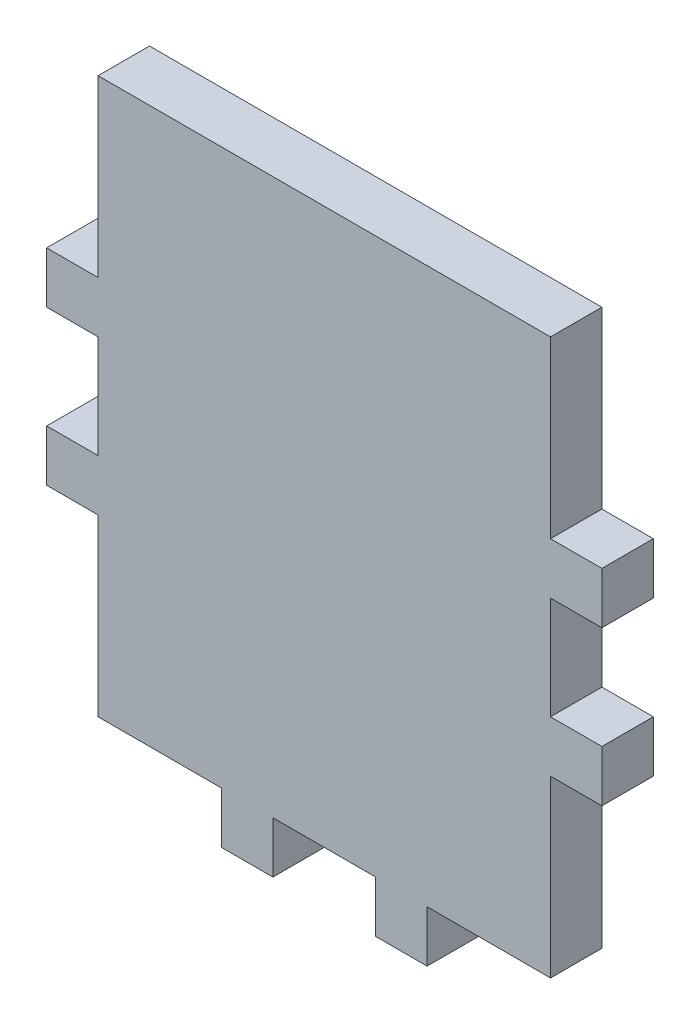
ISO-10303-21;
HEADER;
FILE_DESCRIPTION(('STEP AP214'),'2;1');
FILE_NAME('part.step','',(''),(''),'','','');
FILE_SCHEMA(('AUTOMOTIVE_DESIGN { 1 0 10303 214 1 1 1 1 }'));
ENDSEC;
DATA;
#1=APPLICATION_CONTEXT('core data for automotive mechanical design processes');
#2=APPLICATION_PROTOCOL_DEFINITION('international standard','automotive_design',2000,#1);
#3=PRODUCT_CONTEXT('',#1,'mechanical');
#4=PRODUCT('Part','Part','',(#3));
#5=PRODUCT_RELATED_PRODUCT_CATEGORY('part','',(#4));
#6=PRODUCT_DEFINITION_FORMATION('','',#4);
#7=PRODUCT_DEFINITION_CONTEXT('part definition',#1,'design');
#8=PRODUCT_DEFINITION('design','',#6,#7);
#9=PRODUCT_DEFINITION_SHAPE('','',#8);
#10=(LENGTH_UNIT() NAMED_UNIT(*) SI_UNIT(.MILLI.,.METRE.));
#11=(NAMED_UNIT(*) PLANE_ANGLE_UNIT() SI_UNIT($,.RADIAN.));
#12=(NAMED_UNIT(*) SI_UNIT($,.STERADIAN.) SOLID_ANGLE_UNIT());
#13=UNCERTAINTY_MEASURE_WITH_UNIT(LENGTH_MEASURE(1.E-05),#10,'distance_accuracy_value','');
#14=(GEOMETRIC_REPRESENTATION_CONTEXT(3) GLOBAL_UNCERTAINTY_ASSIGNED_CONTEXT((#13)) GLOBAL_UNIT_ASSIGNED_CONTEXT((#10,
#11,#12)) REPRESENTATION_CONTEXT('',''));
#15=CARTESIAN_POINT('',(0.,0.,0.));
#16=DIRECTION('',(0.,0.,1.));
#17=DIRECTION('',(1.,0.,0.));
#18=AXIS2_PLACEMENT_3D('',#15,#16,#17);
#19=CARTESIAN_POINT('',(0.,17.,5.));
#20=DIRECTION('',(0.,1.,0.));
#21=DIRECTION('',(0.,0.,1.));
#22=AXIS2_PLACEMENT_3D('',#19,#20,#21);
#23=PLANE('',#22);
#24=DIRECTION('',(1.,0.,0.));
#25=VECTOR('',#24,1.);
#26=CARTESIAN_POINT('',(0.,17.,0.));
#27=LINE('',#26,#25);
#28=CARTESIAN_POINT('',(-27.,17.,0.));
#29=VERTEX_POINT('',#28);
#30=CARTESIAN_POINT('',(-22.,17.,0.));
#31=VERTEX_POINT('',#30);
#32=EDGE_CURVE('E254',#29,#31,#27,.T.);
#33=ORIENTED_EDGE('',*,*,#32,.T.);
#34=DIRECTION('',(0.,0.,-1.));
#35=VECTOR('',#34,1.);
#36=CARTESIAN_POINT('',(-22.,17.,5.));
#37=LINE('',#36,#35);
#38=CARTESIAN_POINT('',(-22.,17.,5.));
#39=VERTEX_POINT('',#38);
#40=EDGE_CURVE('E11',#39,#31,#37,.T.);
#41=ORIENTED_EDGE('',*,*,#40,.F.);
#42=DIRECTION('',(1.,0.,0.));
#43=VECTOR('',#42,1.);
#44=CARTESIAN_POINT('',(0.,17.,5.));
#45=LINE('',#44,#43);
#46=CARTESIAN_POINT('',(-27.,17.,5.));
#47=VERTEX_POINT('',#46);
#48=EDGE_CURVE('E325',#47,#39,#45,.T.);
#49=ORIENTED_EDGE('',*,*,#48,.F.);
#50=DIRECTION('',(0.,0.,-1.));
#51=VECTOR('',#50,1.);
#52=CARTESIAN_POINT('',(-27.,17.,5.));
#53=LINE('',#52,#51);
#54=EDGE_CURVE('E250',#47,#29,#53,.T.);
#55=ORIENTED_EDGE('',*,*,#54,.T.);
#56=EDGE_LOOP('',(#33,#41,#49,#55));
#57=FACE_BOUND('',#56,.T.);
#58=ADVANCED_FACE('F39',(#57),#23,.F.);
#59=CARTESIAN_POINT('',(-22.,0.,5.));
#60=DIRECTION('',(1.,0.,0.));
#61=DIRECTION('',(0.,0.,-1.));
#62=AXIS2_PLACEMENT_3D('',#59,#60,#61);
#63=PLANE('',#62);
#64=DIRECTION('',(0.,-1.,0.));
#65=VECTOR('',#64,1.);
#66=CARTESIAN_POINT('',(-22.,0.,0.));
#67=LINE('',#66,#65);
#68=CARTESIAN_POINT('',(-22.,0.,0.));
#69=VERTEX_POINT('',#68);
#70=EDGE_CURVE('E257',#31,#69,#67,.T.);
#71=ORIENTED_EDGE('',*,*,#70,.T.);
#72=DIRECTION('',(0.,0.,-1.));
#73=VECTOR('',#72,1.);
#74=CARTESIAN_POINT('',(-22.,0.,5.));
#75=LINE('',#74,#73);
#76=CARTESIAN_POINT('',(-22.,0.,5.));
#77=VERTEX_POINT('',#76);
#78=EDGE_CURVE('E47',#77,#69,#75,.T.);
#79=ORIENTED_EDGE('',*,*,#78,.F.);
#80=DIRECTION('',(0.,-1.,0.));
#81=VECTOR('',#80,1.);
#82=CARTESIAN_POINT('',(-22.,0.,5.));
#83=LINE('',#82,#81);
#84=EDGE_CURVE('E154',#39,#77,#83,.T.);
#85=ORIENTED_EDGE('',*,*,#84,.F.);
#86=ORIENTED_EDGE('',*,*,#40,.T.);
#87=EDGE_LOOP('',(#71,#79,#85,#86));
#88=FACE_BOUND('',#87,.T.);
#89=ADVANCED_FACE('F468',(#88),#63,.F.);
#90=CARTESIAN_POINT('',(0.,0.,5.));
#91=DIRECTION('',(0.,1.,0.));
#92=DIRECTION('',(-1.,0.,0.));
#93=AXIS2_PLACEMENT_3D('',#90,#91,#92);
#94=PLANE('',#93);
#95=DIRECTION('',(1.,0.,0.));
#96=VECTOR('',#95,1.);
#97=CARTESIAN_POINT('',(0.,0.,0.));
#98=LINE('',#97,#96);
#99=CARTESIAN_POINT('',(-9.99999999999999,0.,0.));
#100=VERTEX_POINT('',#99);
#101=EDGE_CURVE('E259',#69,#100,#98,.T.);
#102=ORIENTED_EDGE('',*,*,#101,.T.);
#103=DIRECTION('',(0.,0.,-1.));
#104=VECTOR('',#103,1.);
#105=CARTESIAN_POINT('',(-9.99999999999999,0.,5.));
#106=LINE('',#105,#104);
#107=CARTESIAN_POINT('',(-9.99999999999999,0.,5.));
#108=VERTEX_POINT('',#107);
#109=EDGE_CURVE('E378',#108,#100,#106,.T.);
#110=ORIENTED_EDGE('',*,*,#109,.F.);
#111=DIRECTION('',(1.,0.,0.));
#112=VECTOR('',#111,1.);
#113=CARTESIAN_POINT('',(0.,0.,5.));
#114=LINE('',#113,#112);
#115=EDGE_CURVE('E385',#77,#108,#114,.T.);
#116=ORIENTED_EDGE('',*,*,#115,.F.);
#117=ORIENTED_EDGE('',*,*,#78,.T.);
#118=EDGE_LOOP('',(#102,#110,#116,#117));
#119=FACE_BOUND('',#118,.T.);
#120=ADVANCED_FACE('F383',(#119),#94,.F.);
#121=CARTESIAN_POINT('',(-9.99999999999999,0.,5.));
#122=DIRECTION('',(-1.,0.,0.));
#123=DIRECTION('',(0.,0.,1.));
#124=AXIS2_PLACEMENT_3D('',#121,#122,#123);
#125=PLANE('',#124);
#126=DIRECTION('',(0.,1.,0.));
#127=VECTOR('',#126,1.);
#128=CARTESIAN_POINT('',(-9.99999999999999,0.,0.));
#129=LINE('',#128,#127);
#130=CARTESIAN_POINT('',(-9.99999999999999,-5.,0.));
#131=VERTEX_POINT('',#130);
#132=EDGE_CURVE('E262',#131,#100,#129,.T.);
#133=ORIENTED_EDGE('',*,*,#132,.F.);
#134=DIRECTION('',(0.,0.,-1.));
#135=VECTOR('',#134,1.);
#136=CARTESIAN_POINT('',(-9.99999999999999,-5.,5.));
#137=LINE('',#136,#135);
#138=CARTESIAN_POINT('',(-9.99999999999999,-5.,5.));
#139=VERTEX_POINT('',#138);
#140=EDGE_CURVE('E376',#139,#131,#137,.T.);
#141=ORIENTED_EDGE('',*,*,#140,.F.);
#142=DIRECTION('',(0.,1.,0.));
#143=VECTOR('',#142,1.);
#144=CARTESIAN_POINT('',(-9.99999999999999,0.,5.));
#145=LINE('',#144,#143);
#146=EDGE_CURVE('E396',#139,#108,#145,.T.);
#147=ORIENTED_EDGE('',*,*,#146,.T.);
#148=ORIENTED_EDGE('',*,*,#109,.T.);
#149=EDGE_LOOP('',(#133,#141,#147,#148));
#150=FACE_BOUND('',#149,.T.);
#151=ADVANCED_FACE('F393',(#150),#125,.T.);
#152=CARTESIAN_POINT('',(0.,-5.,5.));
#153=DIRECTION('',(0.,-1.,0.));
#154=DIRECTION('',(1.,0.,0.));
#155=AXIS2_PLACEMENT_3D('',#152,#153,#154);
#156=PLANE('',#155);
#157=DIRECTION('',(-1.,0.,0.));
#158=VECTOR('',#157,1.);
#159=CARTESIAN_POINT('',(0.,-5.,0.));
#160=LINE('',#159,#158);
#161=CARTESIAN_POINT('',(-4.99999999999999,-5.,0.));
#162=VERTEX_POINT('',#161);
#163=EDGE_CURVE('E265',#162,#131,#160,.T.);
#164=ORIENTED_EDGE('',*,*,#163,.F.);
#165=DIRECTION('',(0.,0.,-1.));
#166=VECTOR('',#165,1.);
#167=CARTESIAN_POINT('',(-4.99999999999999,-5.,5.));
#168=LINE('',#167,#166);
#169=CARTESIAN_POINT('',(-4.99999999999999,-5.,5.));
#170=VERTEX_POINT('',#169);
#171=EDGE_CURVE('E374',#170,#162,#168,.T.);
#172=ORIENTED_EDGE('',*,*,#171,.F.);
#173=DIRECTION('',(-1.,0.,0.));
#174=VECTOR('',#173,1.);
#175=CARTESIAN_POINT('',(0.,-5.,5.));
#176=LINE('',#175,#174);
#177=EDGE_CURVE('E399',#170,#139,#176,.T.);
#178=ORIENTED_EDGE('',*,*,#177,.T.);
#179=ORIENTED_EDGE('',*,*,#140,.T.);
#180=EDGE_LOOP('',(#164,#172,#178,#179));
#181=FACE_BOUND('',#180,.T.);
#182=ADVANCED_FACE('F479',(#181),#156,.T.);
#183=CARTESIAN_POINT('',(-4.99999999999999,0.,5.));
#184=DIRECTION('',(-1.,0.,0.));
#185=DIRECTION('',(0.,0.,1.));
#186=AXIS2_PLACEMENT_3D('',#183,#184,#185);
#187=PLANE('',#186);
#188=DIRECTION('',(0.,1.,0.));
#189=VECTOR('',#188,1.);
#190=CARTESIAN_POINT('',(-4.99999999999999,0.,0.));
#191=LINE('',#190,#189);
#192=CARTESIAN_POINT('',(-4.99999999999999,0.,0.));
#193=VERTEX_POINT('',#192);
#194=EDGE_CURVE('E268',#162,#193,#191,.T.);
#195=ORIENTED_EDGE('',*,*,#194,.T.);
#196=DIRECTION('',(0.,0.,-1.));
#197=VECTOR('',#196,1.);
#198=CARTESIAN_POINT('',(-4.99999999999999,0.,5.));
#199=LINE('',#198,#197);
#200=CARTESIAN_POINT('',(-4.99999999999999,0.,5.));
#201=VERTEX_POINT('',#200);
#202=EDGE_CURVE('E372',#201,#193,#199,.T.);
#203=ORIENTED_EDGE('',*,*,#202,.F.);
#204=DIRECTION('',(0.,1.,0.));
#205=VECTOR('',#204,1.);
#206=CARTESIAN_POINT('',(-4.99999999999999,0.,5.));
#207=LINE('',#206,#205);
#208=EDGE_CURVE('E401',#170,#201,#207,.T.);
#209=ORIENTED_EDGE('',*,*,#208,.F.);
#210=ORIENTED_EDGE('',*,*,#171,.T.);
#211=EDGE_LOOP('',(#195,#203,#209,#210));
#212=FACE_BOUND('',#211,.T.);
#213=ADVANCED_FACE('F482',(#212),#187,.F.);
#214=CARTESIAN_POINT('',(0.,0.,5.));
#215=DIRECTION('',(0.,-1.,0.));
#216=DIRECTION('',(1.,0.,0.));
#217=AXIS2_PLACEMENT_3D('',#214,#215,#216);
#218=PLANE('',#217);
#219=DIRECTION('',(-1.,0.,0.));
#220=VECTOR('',#219,1.);
#221=CARTESIAN_POINT('',(0.,0.,0.));
#222=LINE('',#221,#220);
#223=CARTESIAN_POINT('',(5.00000000000001,0.,0.));
#224=VERTEX_POINT('',#223);
#225=EDGE_CURVE('E271',#224,#193,#222,.T.);
#226=ORIENTED_EDGE('',*,*,#225,.F.);
#227=DIRECTION('',(0.,0.,-1.));
#228=VECTOR('',#227,1.);
#229=CARTESIAN_POINT('',(5.00000000000001,0.,5.));
#230=LINE('',#229,#228);
#231=CARTESIAN_POINT('',(5.00000000000001,0.,5.));
#232=VERTEX_POINT('',#231);
#233=EDGE_CURVE('E370',#232,#224,#230,.T.);
#234=ORIENTED_EDGE('',*,*,#233,.F.);
#235=DIRECTION('',(-1.,0.,0.));
#236=VECTOR('',#235,1.);
#237=CARTESIAN_POINT('',(0.,0.,5.));
#238=LINE('',#237,#236);
#239=EDGE_CURVE('E407',#232,#201,#238,.T.);
#240=ORIENTED_EDGE('',*,*,#239,.T.);
#241=ORIENTED_EDGE('',*,*,#202,.T.);
#242=EDGE_LOOP('',(#226,#234,#240,#241));
#243=FACE_BOUND('',#242,.T.);
#244=ADVANCED_FACE('F486',(#243),#218,.T.);
#245=CARTESIAN_POINT('',(5.00000000000001,0.,5.));
#246=DIRECTION('',(1.,0.,0.));
#247=DIRECTION('',(0.,0.,-1.));
#248=AXIS2_PLACEMENT_3D('',#245,#246,#247);
#249=PLANE('',#248);
#250=DIRECTION('',(0.,-1.,0.));
#251=VECTOR('',#250,1.);
#252=CARTESIAN_POINT('',(5.00000000000001,0.,0.));
#253=LINE('',#252,#251);
#254=CARTESIAN_POINT('',(5.00000000000001,-5.,0.));
#255=VERTEX_POINT('',#254);
#256=EDGE_CURVE('E274',#224,#255,#253,.T.);
#257=ORIENTED_EDGE('',*,*,#256,.T.);
#258=DIRECTION('',(0.,0.,-1.));
#259=VECTOR('',#258,1.);
#260=CARTESIAN_POINT('',(5.00000000000001,-5.,5.));
#261=LINE('',#260,#259);
#262=CARTESIAN_POINT('',(5.00000000000001,-5.,5.));
#263=VERTEX_POINT('',#262);
#264=EDGE_CURVE('E367',#263,#255,#261,.T.);
#265=ORIENTED_EDGE('',*,*,#264,.F.);
#266=DIRECTION('',(0.,-1.,0.));
#267=VECTOR('',#266,1.);
#268=CARTESIAN_POINT('',(5.00000000000001,0.,5.));
#269=LINE('',#268,#267);
#270=EDGE_CURVE('E410',#232,#263,#269,.T.);
#271=ORIENTED_EDGE('',*,*,#270,.F.);
#272=ORIENTED_EDGE('',*,*,#233,.T.);
#273=EDGE_LOOP('',(#257,#265,#271,#272));
#274=FACE_BOUND('',#273,.T.);
#275=ADVANCED_FACE('F490',(#274),#249,.F.);
#276=CARTESIAN_POINT('',(0.,-5.,5.));
#277=DIRECTION('',(0.,1.,0.));
#278=DIRECTION('',(-1.,0.,0.));
#279=AXIS2_PLACEMENT_3D('',#276,#277,#278);
#280=PLANE('',#279);
#281=DIRECTION('',(1.,0.,0.));
#282=VECTOR('',#281,1.);
#283=CARTESIAN_POINT('',(0.,-5.,0.));
#284=LINE('',#283,#282);
#285=CARTESIAN_POINT('',(10.,-5.,0.));
#286=VERTEX_POINT('',#285);
#287=EDGE_CURVE('E276',#255,#286,#284,.T.);
#288=ORIENTED_EDGE('',*,*,#287,.T.);
#289=DIRECTION('',(0.,0.,-1.));
#290=VECTOR('',#289,1.);
#291=CARTESIAN_POINT('',(10.,-5.,5.));
#292=LINE('',#291,#290);
#293=CARTESIAN_POINT('',(10.,-5.,5.));
#294=VERTEX_POINT('',#293);
#295=EDGE_CURVE('E364',#294,#286,#292,.T.);
#296=ORIENTED_EDGE('',*,*,#295,.F.);
#297=DIRECTION('',(1.,0.,0.));
#298=VECTOR('',#297,1.);
#299=CARTESIAN_POINT('',(0.,-5.,5.));
#300=LINE('',#299,#298);
#301=EDGE_CURVE('E412',#263,#294,#300,.T.);
#302=ORIENTED_EDGE('',*,*,#301,.F.);
#303=ORIENTED_EDGE('',*,*,#264,.T.);
#304=EDGE_LOOP('',(#288,#296,#302,#303));
#305=FACE_BOUND('',#304,.T.);
#306=ADVANCED_FACE('F494',(#305),#280,.F.);
#307=CARTESIAN_POINT('',(10.,0.,5.));
#308=DIRECTION('',(-1.,0.,0.));
#309=DIRECTION('',(0.,0.,1.));
#310=AXIS2_PLACEMENT_3D('',#307,#308,#309);
#311=PLANE('',#310);
#312=DIRECTION('',(0.,1.,0.));
#313=VECTOR('',#312,1.);
#314=CARTESIAN_POINT('',(10.,0.,0.));
#315=LINE('',#314,#313);
#316=CARTESIAN_POINT('',(10.,0.,0.));
#317=VERTEX_POINT('',#316);
#318=EDGE_CURVE('E278',#286,#317,#315,.T.);
#319=ORIENTED_EDGE('',*,*,#318,.T.);
#320=DIRECTION('',(0.,0.,-1.));
#321=VECTOR('',#320,1.);
#322=CARTESIAN_POINT('',(10.,0.,5.));
#323=LINE('',#322,#321);
#324=CARTESIAN_POINT('',(10.,0.,5.));
#325=VERTEX_POINT('',#324);
#326=EDGE_CURVE('E361',#325,#317,#323,.T.);
#327=ORIENTED_EDGE('',*,*,#326,.F.);
#328=DIRECTION('',(0.,1.,0.));
#329=VECTOR('',#328,1.);
#330=CARTESIAN_POINT('',(10.,0.,5.));
#331=LINE('',#330,#329);
#332=EDGE_CURVE('E414',#294,#325,#331,.T.);
#333=ORIENTED_EDGE('',*,*,#332,.F.);
#334=ORIENTED_EDGE('',*,*,#295,.T.);
#335=EDGE_LOOP('',(#319,#327,#333,#334));
#336=FACE_BOUND('',#335,.T.);
#337=ADVANCED_FACE('F498',(#336),#311,.F.);
#338=CARTESIAN_POINT('',(0.,0.,5.));
#339=DIRECTION('',(0.,1.,0.));
#340=DIRECTION('',(-1.,0.,0.));
#341=AXIS2_PLACEMENT_3D('',#338,#339,#340);
#342=PLANE('',#341);
#343=DIRECTION('',(1.,0.,0.));
#344=VECTOR('',#343,1.);
#345=CARTESIAN_POINT('',(0.,0.,0.));
#346=LINE('',#345,#344);
#347=CARTESIAN_POINT('',(22.,0.,0.));
#348=VERTEX_POINT('',#347);
#349=EDGE_CURVE('E280',#317,#348,#346,.T.);
#350=ORIENTED_EDGE('',*,*,#349,.T.);
#351=DIRECTION('',(0.,0.,-1.));
#352=VECTOR('',#351,1.);
#353=CARTESIAN_POINT('',(22.,0.,5.));
#354=LINE('',#353,#352);
#355=CARTESIAN_POINT('',(22.,0.,5.));
#356=VERTEX_POINT('',#355);
#357=EDGE_CURVE('E358',#356,#348,#354,.T.);
#358=ORIENTED_EDGE('',*,*,#357,.F.);
#359=DIRECTION('',(1.,0.,0.));
#360=VECTOR('',#359,1.);
#361=CARTESIAN_POINT('',(0.,0.,5.));
#362=LINE('',#361,#360);
#363=EDGE_CURVE('E416',#325,#356,#362,.T.);
#364=ORIENTED_EDGE('',*,*,#363,.F.);
#365=ORIENTED_EDGE('',*,*,#326,.T.);
#366=EDGE_LOOP('',(#350,#358,#364,#365));
#367=FACE_BOUND('',#366,.T.);
#368=ADVANCED_FACE('F502',(#367),#342,.F.);
#369=CARTESIAN_POINT('',(22.,0.,5.));
#370=DIRECTION('',(-1.,0.,0.));
#371=DIRECTION('',(0.,-1.,0.));
#372=AXIS2_PLACEMENT_3D('',#369,#370,#371);
#373=PLANE('',#372);
#374=DIRECTION('',(0.,1.,0.));
#375=VECTOR('',#374,1.);
#376=CARTESIAN_POINT('',(22.,0.,0.));
#377=LINE('',#376,#375);
#378=CARTESIAN_POINT('',(22.,17.,0.));
#379=VERTEX_POINT('',#378);
#380=EDGE_CURVE('E282',#348,#379,#377,.T.);
#381=ORIENTED_EDGE('',*,*,#380,.T.);
#382=DIRECTION('',(0.,0.,-1.));
#383=VECTOR('',#382,1.);
#384=CARTESIAN_POINT('',(22.,17.,5.));
#385=LINE('',#384,#383);
#386=CARTESIAN_POINT('',(22.,17.,5.));
#387=VERTEX_POINT('',#386);
#388=EDGE_CURVE('E356',#387,#379,#385,.T.);
#389=ORIENTED_EDGE('',*,*,#388,.F.);
#390=DIRECTION('',(0.,1.,0.));
#391=VECTOR('',#390,1.);
#392=CARTESIAN_POINT('',(22.,0.,5.));
#393=LINE('',#392,#391);
#394=EDGE_CURVE('E418',#356,#387,#393,.T.);
#395=ORIENTED_EDGE('',*,*,#394,.F.);
#396=ORIENTED_EDGE('',*,*,#357,.T.);
#397=EDGE_LOOP('',(#381,#389,#395,#396));
#398=FACE_BOUND('',#397,.T.);
#399=ADVANCED_FACE('F506',(#398),#373,.F.);
#400=CARTESIAN_POINT('',(0.,17.,5.));
#401=DIRECTION('',(0.,-1.,0.));
#402=DIRECTION('',(0.,0.,-1.));
#403=AXIS2_PLACEMENT_3D('',#400,#401,#402);
#404=PLANE('',#403);
#405=DIRECTION('',(-1.,0.,0.));
#406=VECTOR('',#405,1.);
#407=CARTESIAN_POINT('',(0.,17.,0.));
#408=LINE('',#407,#406);
#409=CARTESIAN_POINT('',(27.,17.,0.));
#410=VERTEX_POINT('',#409);
#411=EDGE_CURVE('E285',#410,#379,#408,.T.);
#412=ORIENTED_EDGE('',*,*,#411,.F.);
#413=DIRECTION('',(0.,0.,-1.));
#414=VECTOR('',#413,1.);
#415=CARTESIAN_POINT('',(27.,17.,5.));
#416=LINE('',#415,#414);
#417=CARTESIAN_POINT('',(27.,17.,5.));
#418=VERTEX_POINT('',#417);
#419=EDGE_CURVE('E354',#418,#410,#416,.T.);
#420=ORIENTED_EDGE('',*,*,#419,.F.);
#421=DIRECTION('',(-1.,0.,0.));
#422=VECTOR('',#421,1.);
#423=CARTESIAN_POINT('',(0.,17.,5.));
#424=LINE('',#423,#422);
#425=EDGE_CURVE('E420',#418,#387,#424,.T.);
#426=ORIENTED_EDGE('',*,*,#425,.T.);
#427=ORIENTED_EDGE('',*,*,#388,.T.);
#428=EDGE_LOOP('',(#412,#420,#426,#427));
#429=FACE_BOUND('',#428,.T.);
#430=ADVANCED_FACE('F510',(#429),#404,.T.);
#431=CARTESIAN_POINT('',(27.,0.,5.));
#432=DIRECTION('',(1.,0.,0.));
#433=DIRECTION('',(0.,0.,-1.));
#434=AXIS2_PLACEMENT_3D('',#431,#432,#433);
#435=PLANE('',#434);
#436=DIRECTION('',(0.,-1.,0.));
#437=VECTOR('',#436,1.);
#438=CARTESIAN_POINT('',(27.,0.,0.));
#439=LINE('',#438,#437);
#440=CARTESIAN_POINT('',(27.,22.,0.));
#441=VERTEX_POINT('',#440);
#442=EDGE_CURVE('E288',#441,#410,#439,.T.);
#443=ORIENTED_EDGE('',*,*,#442,.F.);
#444=DIRECTION('',(0.,0.,-1.));
#445=VECTOR('',#444,1.);
#446=CARTESIAN_POINT('',(27.,22.,5.));
#447=LINE('',#446,#445);
#448=CARTESIAN_POINT('',(27.,22.,5.));
#449=VERTEX_POINT('',#448);
#450=EDGE_CURVE('E352',#449,#441,#447,.T.);
#451=ORIENTED_EDGE('',*,*,#450,.F.);
#452=DIRECTION('',(0.,-1.,0.));
#453=VECTOR('',#452,1.);
#454=CARTESIAN_POINT('',(27.,0.,5.));
#455=LINE('',#454,#453);
#456=EDGE_CURVE('E423',#449,#418,#455,.T.);
#457=ORIENTED_EDGE('',*,*,#456,.T.);
#458=ORIENTED_EDGE('',*,*,#419,.T.);
#459=EDGE_LOOP('',(#443,#451,#457,#458));
#460=FACE_BOUND('',#459,.T.);
#461=ADVANCED_FACE('F514',(#460),#435,.T.);
#462=CARTESIAN_POINT('',(0.,22.,5.));
#463=DIRECTION('',(0.,-1.,0.));
#464=DIRECTION('',(1.,0.,0.));
#465=AXIS2_PLACEMENT_3D('',#462,#463,#464);
#466=PLANE('',#465);
#467=DIRECTION('',(-1.,0.,0.));
#468=VECTOR('',#467,1.);
#469=CARTESIAN_POINT('',(0.,22.,0.));
#470=LINE('',#469,#468);
#471=CARTESIAN_POINT('',(22.,22.,0.));
#472=VERTEX_POINT('',#471);
#473=EDGE_CURVE('E291',#441,#472,#470,.T.);
#474=ORIENTED_EDGE('',*,*,#473,.T.);
#475=DIRECTION('',(0.,0.,-1.));
#476=VECTOR('',#475,1.);
#477=CARTESIAN_POINT('',(22.,22.,5.));
#478=LINE('',#477,#476);
#479=CARTESIAN_POINT('',(22.,22.,5.));
#480=VERTEX_POINT('',#479);
#481=EDGE_CURVE('E350',#480,#472,#478,.T.);
#482=ORIENTED_EDGE('',*,*,#481,.F.);
#483=DIRECTION('',(-1.,0.,0.));
#484=VECTOR('',#483,1.);
#485=CARTESIAN_POINT('',(0.,22.,5.));
#486=LINE('',#485,#484);
#487=EDGE_CURVE('E426',#449,#480,#486,.T.);
#488=ORIENTED_EDGE('',*,*,#487,.F.);
#489=ORIENTED_EDGE('',*,*,#450,.T.);
#490=EDGE_LOOP('',(#474,#482,#488,#489));
#491=FACE_BOUND('',#490,.T.);
#492=ADVANCED_FACE('F518',(#491),#466,.F.);
#493=CARTESIAN_POINT('',(22.,0.,5.));
#494=DIRECTION('',(1.,0.,0.));
#495=DIRECTION('',(0.,1.,0.));
#496=AXIS2_PLACEMENT_3D('',#493,#494,#495);
#497=PLANE('',#496);
#498=DIRECTION('',(0.,-1.,0.));
#499=VECTOR('',#498,1.);
#500=CARTESIAN_POINT('',(22.,0.,0.));
#501=LINE('',#500,#499);
#502=CARTESIAN_POINT('',(22.,32.,0.));
#503=VERTEX_POINT('',#502);
#504=EDGE_CURVE('E294',#503,#472,#501,.T.);
#505=ORIENTED_EDGE('',*,*,#504,.F.);
#506=DIRECTION('',(0.,0.,-1.));
#507=VECTOR('',#506,1.);
#508=CARTESIAN_POINT('',(22.,32.,5.));
#509=LINE('',#508,#507);
#510=CARTESIAN_POINT('',(22.,32.,5.));
#511=VERTEX_POINT('',#510);
#512=EDGE_CURVE('E348',#511,#503,#509,.T.);
#513=ORIENTED_EDGE('',*,*,#512,.F.);
#514=DIRECTION('',(0.,-1.,0.));
#515=VECTOR('',#514,1.);
#516=CARTESIAN_POINT('',(22.,0.,5.));
#517=LINE('',#516,#515);
#518=EDGE_CURVE('E428',#511,#480,#517,.T.);
#519=ORIENTED_EDGE('',*,*,#518,.T.);
#520=ORIENTED_EDGE('',*,*,#481,.T.);
#521=EDGE_LOOP('',(#505,#513,#519,#520));
#522=FACE_BOUND('',#521,.T.);
#523=ADVANCED_FACE('F522',(#522),#497,.T.);
#524=CARTESIAN_POINT('',(0.,32.,5.));
#525=DIRECTION('',(0.,1.,0.));
#526=DIRECTION('',(-1.,0.,0.));
#527=AXIS2_PLACEMENT_3D('',#524,#525,#526);
#528=PLANE('',#527);
#529=DIRECTION('',(1.,0.,0.));
#530=VECTOR('',#529,1.);
#531=CARTESIAN_POINT('',(0.,32.,0.));
#532=LINE('',#531,#530);
#533=CARTESIAN_POINT('',(27.,32.,0.));
#534=VERTEX_POINT('',#533);
#535=EDGE_CURVE('E297',#503,#534,#532,.T.);
#536=ORIENTED_EDGE('',*,*,#535,.T.);
#537=DIRECTION('',(0.,0.,-1.));
#538=VECTOR('',#537,1.);
#539=CARTESIAN_POINT('',(27.,32.,5.));
#540=LINE('',#539,#538);
#541=CARTESIAN_POINT('',(27.,32.,5.));
#542=VERTEX_POINT('',#541);
#543=EDGE_CURVE('E345',#542,#534,#540,.T.);
#544=ORIENTED_EDGE('',*,*,#543,.F.);
#545=DIRECTION('',(1.,0.,0.));
#546=VECTOR('',#545,1.);
#547=CARTESIAN_POINT('',(0.,32.,5.));
#548=LINE('',#547,#546);
#549=EDGE_CURVE('E431',#511,#542,#548,.T.);
#550=ORIENTED_EDGE('',*,*,#549,.F.);
#551=ORIENTED_EDGE('',*,*,#512,.T.);
#552=EDGE_LOOP('',(#536,#544,#550,#551));
#553=FACE_BOUND('',#552,.T.);
#554=ADVANCED_FACE('F526',(#553),#528,.F.);
#555=CARTESIAN_POINT('',(27.,0.,5.));
#556=DIRECTION('',(-1.,0.,0.));
#557=DIRECTION('',(0.,0.,1.));
#558=AXIS2_PLACEMENT_3D('',#555,#556,#557);
#559=PLANE('',#558);
#560=DIRECTION('',(0.,1.,0.));
#561=VECTOR('',#560,1.);
#562=CARTESIAN_POINT('',(27.,0.,0.));
#563=LINE('',#562,#561);
#564=CARTESIAN_POINT('',(27.,37.,0.));
#565=VERTEX_POINT('',#564);
#566=EDGE_CURVE('E299',#534,#565,#563,.T.);
#567=ORIENTED_EDGE('',*,*,#566,.T.);
#568=DIRECTION('',(0.,0.,-1.));
#569=VECTOR('',#568,1.);
#570=CARTESIAN_POINT('',(27.,37.,5.));
#571=LINE('',#570,#569);
#572=CARTESIAN_POINT('',(27.,37.,5.));
#573=VERTEX_POINT('',#572);
#574=EDGE_CURVE('E342',#573,#565,#571,.T.);
#575=ORIENTED_EDGE('',*,*,#574,.F.);
#576=DIRECTION('',(0.,1.,0.));
#577=VECTOR('',#576,1.);
#578=CARTESIAN_POINT('',(27.,0.,5.));
#579=LINE('',#578,#577);
#580=EDGE_CURVE('E433',#542,#573,#579,.T.);
#581=ORIENTED_EDGE('',*,*,#580,.F.);
#582=ORIENTED_EDGE('',*,*,#543,.T.);
#583=EDGE_LOOP('',(#567,#575,#581,#582));
#584=FACE_BOUND('',#583,.T.);
#585=ADVANCED_FACE('F530',(#584),#559,.F.);
#586=CARTESIAN_POINT('',(0.,37.,5.));
#587=DIRECTION('',(0.,-1.,0.));
#588=DIRECTION('',(0.,0.,-1.));
#589=AXIS2_PLACEMENT_3D('',#586,#587,#588);
#590=PLANE('',#589);
#591=DIRECTION('',(-1.,0.,0.));
#592=VECTOR('',#591,1.);
#593=CARTESIAN_POINT('',(0.,37.,0.));
#594=LINE('',#593,#592);
#595=CARTESIAN_POINT('',(22.,37.,0.));
#596=VERTEX_POINT('',#595);
#597=EDGE_CURVE('E301',#565,#596,#594,.T.);
#598=ORIENTED_EDGE('',*,*,#597,.T.);
#599=DIRECTION('',(0.,0.,-1.));
#600=VECTOR('',#599,1.);
#601=CARTESIAN_POINT('',(22.,37.,5.));
#602=LINE('',#601,#600);
#603=CARTESIAN_POINT('',(22.,37.,5.));
#604=VERTEX_POINT('',#603);
#605=EDGE_CURVE('E339',#604,#596,#602,.T.);
#606=ORIENTED_EDGE('',*,*,#605,.F.);
#607=DIRECTION('',(-1.,0.,0.));
#608=VECTOR('',#607,1.);
#609=CARTESIAN_POINT('',(0.,37.,5.));
#610=LINE('',#609,#608);
#611=EDGE_CURVE('E435',#573,#604,#610,.T.);
#612=ORIENTED_EDGE('',*,*,#611,.F.);
#613=ORIENTED_EDGE('',*,*,#574,.T.);
#614=EDGE_LOOP('',(#598,#606,#612,#613));
#615=FACE_BOUND('',#614,.T.);
#616=ADVANCED_FACE('F534',(#615),#590,.F.);
#617=CARTESIAN_POINT('',(21.9999999999999,0.,5.));
#618=DIRECTION('',(-1.,0.,0.));
#619=DIRECTION('',(0.,-1.,0.));
#620=AXIS2_PLACEMENT_3D('',#617,#618,#619);
#621=PLANE('',#620);
#622=DIRECTION('',(0.,1.,0.));
#623=VECTOR('',#622,1.);
#624=CARTESIAN_POINT('',(21.9999999999999,0.,0.));
#625=LINE('',#624,#623);
#626=CARTESIAN_POINT('',(22.,54.,0.));
#627=VERTEX_POINT('',#626);
#628=EDGE_CURVE('E303',#596,#627,#625,.T.);
#629=ORIENTED_EDGE('',*,*,#628,.T.);
#630=DIRECTION('',(0.,0.,-1.));
#631=VECTOR('',#630,1.);
#632=CARTESIAN_POINT('',(22.,54.,5.));
#633=LINE('',#632,#631);
#634=CARTESIAN_POINT('',(22.,54.,5.));
#635=VERTEX_POINT('',#634);
#636=EDGE_CURVE('E337',#635,#627,#633,.T.);
#637=ORIENTED_EDGE('',*,*,#636,.F.);
#638=DIRECTION('',(0.,1.,0.));
#639=VECTOR('',#638,1.);
#640=CARTESIAN_POINT('',(21.9999999999999,0.,5.));
#641=LINE('',#640,#639);
#642=EDGE_CURVE('E437',#604,#635,#641,.T.);
#643=ORIENTED_EDGE('',*,*,#642,.F.);
#644=ORIENTED_EDGE('',*,*,#605,.T.);
#645=EDGE_LOOP('',(#629,#637,#643,#644));
#646=FACE_BOUND('',#645,.T.);
#647=ADVANCED_FACE('F538',(#646),#621,.F.);
#648=CARTESIAN_POINT('',(0.,54.,5.));
#649=DIRECTION('',(0.,1.,0.));
#650=DIRECTION('',(-1.,0.,0.));
#651=AXIS2_PLACEMENT_3D('',#648,#649,#650);
#652=PLANE('',#651);
#653=DIRECTION('',(1.,0.,0.));
#654=VECTOR('',#653,1.);
#655=CARTESIAN_POINT('',(0.,54.,0.));
#656=LINE('',#655,#654);
#657=CARTESIAN_POINT('',(-22.,54.,0.));
#658=VERTEX_POINT('',#657);
#659=EDGE_CURVE('E306',#658,#627,#656,.T.);
#660=ORIENTED_EDGE('',*,*,#659,.F.);
#661=DIRECTION('',(0.,0.,-1.));
#662=VECTOR('',#661,1.);
#663=CARTESIAN_POINT('',(-22.,54.,5.));
#664=LINE('',#663,#662);
#665=CARTESIAN_POINT('',(-22.,54.,5.));
#666=VERTEX_POINT('',#665);
#667=EDGE_CURVE('E335',#666,#658,#664,.T.);
#668=ORIENTED_EDGE('',*,*,#667,.F.);
#669=DIRECTION('',(1.,0.,0.));
#670=VECTOR('',#669,1.);
#671=CARTESIAN_POINT('',(0.,54.,5.));
#672=LINE('',#671,#670);
#673=EDGE_CURVE('E439',#666,#635,#672,.T.);
#674=ORIENTED_EDGE('',*,*,#673,.T.);
#675=ORIENTED_EDGE('',*,*,#636,.T.);
#676=EDGE_LOOP('',(#660,#668,#674,#675));
#677=FACE_BOUND('',#676,.T.);
#678=ADVANCED_FACE('F542',(#677),#652,.T.);
#679=CARTESIAN_POINT('',(-21.9999999999999,0.,5.));
#680=DIRECTION('',(-1.,0.,0.));
#681=DIRECTION('',(0.,-1.,0.));
#682=AXIS2_PLACEMENT_3D('',#679,#680,#681);
#683=PLANE('',#682);
#684=DIRECTION('',(0.,1.,0.));
#685=VECTOR('',#684,1.);
#686=CARTESIAN_POINT('',(-21.9999999999999,0.,0.));
#687=LINE('',#686,#685);
#688=CARTESIAN_POINT('',(-22.,37.,0.));
#689=VERTEX_POINT('',#688);
#690=EDGE_CURVE('E309',#689,#658,#687,.T.);
#691=ORIENTED_EDGE('',*,*,#690,.F.);
#692=DIRECTION('',(0.,0.,-1.));
#693=VECTOR('',#692,1.);
#694=CARTESIAN_POINT('',(-22.,37.,5.));
#695=LINE('',#694,#693);
#696=CARTESIAN_POINT('',(-22.,37.,5.));
#697=VERTEX_POINT('',#696);
#698=EDGE_CURVE('E333',#697,#689,#695,.T.);
#699=ORIENTED_EDGE('',*,*,#698,.F.);
#700=DIRECTION('',(0.,1.,0.));
#701=VECTOR('',#700,1.);
#702=CARTESIAN_POINT('',(-21.9999999999999,0.,5.));
#703=LINE('',#702,#701);
#704=EDGE_CURVE('E442',#697,#666,#703,.T.);
#705=ORIENTED_EDGE('',*,*,#704,.T.);
#706=ORIENTED_EDGE('',*,*,#667,.T.);
#707=EDGE_LOOP('',(#691,#699,#705,#706));
#708=FACE_BOUND('',#707,.T.);
#709=ADVANCED_FACE('F546',(#708),#683,.T.);
#710=CARTESIAN_POINT('',(0.,37.,5.));
#711=DIRECTION('',(0.,1.,0.));
#712=DIRECTION('',(0.,0.,1.));
#713=AXIS2_PLACEMENT_3D('',#710,#711,#712);
#714=PLANE('',#713);
#715=DIRECTION('',(1.,0.,0.));
#716=VECTOR('',#715,1.);
#717=CARTESIAN_POINT('',(0.,37.,0.));
#718=LINE('',#717,#716);
#719=CARTESIAN_POINT('',(-27.,37.,0.));
#720=VERTEX_POINT('',#719);
#721=EDGE_CURVE('E312',#720,#689,#718,.T.);
#722=ORIENTED_EDGE('',*,*,#721,.F.);
#723=DIRECTION('',(0.,0.,-1.));
#724=VECTOR('',#723,1.);
#725=CARTESIAN_POINT('',(-27.,37.,5.));
#726=LINE('',#725,#724);
#727=CARTESIAN_POINT('',(-27.,37.,5.));
#728=VERTEX_POINT('',#727);
#729=EDGE_CURVE('E331',#728,#720,#726,.T.);
#730=ORIENTED_EDGE('',*,*,#729,.F.);
#731=DIRECTION('',(1.,0.,0.));
#732=VECTOR('',#731,1.);
#733=CARTESIAN_POINT('',(0.,37.,5.));
#734=LINE('',#733,#732);
#735=EDGE_CURVE('E445',#728,#697,#734,.T.);
#736=ORIENTED_EDGE('',*,*,#735,.T.);
#737=ORIENTED_EDGE('',*,*,#698,.T.);
#738=EDGE_LOOP('',(#722,#730,#736,#737));
#739=FACE_BOUND('',#738,.T.);
#740=ADVANCED_FACE('F550',(#739),#714,.T.);
#741=CARTESIAN_POINT('',(-27.,0.,5.));
#742=DIRECTION('',(-1.,0.,0.));
#743=DIRECTION('',(0.,-1.,0.));
#744=AXIS2_PLACEMENT_3D('',#741,#742,#743);
#745=PLANE('',#744);
#746=DIRECTION('',(0.,1.,0.));
#747=VECTOR('',#746,1.);
#748=CARTESIAN_POINT('',(-27.,0.,0.));
#749=LINE('',#748,#747);
#750=CARTESIAN_POINT('',(-27.,32.,0.));
#751=VERTEX_POINT('',#750);
#752=EDGE_CURVE('E315',#751,#720,#749,.T.);
#753=ORIENTED_EDGE('',*,*,#752,.F.);
#754=DIRECTION('',(0.,0.,-1.));
#755=VECTOR('',#754,1.);
#756=CARTESIAN_POINT('',(-27.,32.,5.));
#757=LINE('',#756,#755);
#758=CARTESIAN_POINT('',(-27.,32.,5.));
#759=VERTEX_POINT('',#758);
#760=EDGE_CURVE('E329',#759,#751,#757,.T.);
#761=ORIENTED_EDGE('',*,*,#760,.F.);
#762=DIRECTION('',(0.,1.,0.));
#763=VECTOR('',#762,1.);
#764=CARTESIAN_POINT('',(-27.,0.,5.));
#765=LINE('',#764,#763);
#766=EDGE_CURVE('E448',#759,#728,#765,.T.);
#767=ORIENTED_EDGE('',*,*,#766,.T.);
#768=ORIENTED_EDGE('',*,*,#729,.T.);
#769=EDGE_LOOP('',(#753,#761,#767,#768));
#770=FACE_BOUND('',#769,.T.);
#771=ADVANCED_FACE('F554',(#770),#745,.T.);
#772=CARTESIAN_POINT('',(0.,32.,5.));
#773=DIRECTION('',(0.,-1.,0.));
#774=DIRECTION('',(0.,0.,-1.));
#775=AXIS2_PLACEMENT_3D('',#772,#773,#774);
#776=PLANE('',#775);
#777=DIRECTION('',(-1.,0.,0.));
#778=VECTOR('',#777,1.);
#779=CARTESIAN_POINT('',(0.,32.,0.));
#780=LINE('',#779,#778);
#781=CARTESIAN_POINT('',(-22.,32.,0.));
#782=VERTEX_POINT('',#781);
#783=EDGE_CURVE('E318',#782,#751,#780,.T.);
#784=ORIENTED_EDGE('',*,*,#783,.F.);
#785=DIRECTION('',(0.,0.,-1.));
#786=VECTOR('',#785,1.);
#787=CARTESIAN_POINT('',(-22.,32.,5.));
#788=LINE('',#787,#786);
#789=CARTESIAN_POINT('',(-22.,32.,5.));
#790=VERTEX_POINT('',#789);
#791=EDGE_CURVE('E239',#790,#782,#788,.T.);
#792=ORIENTED_EDGE('',*,*,#791,.F.);
#793=DIRECTION('',(-1.,0.,0.));
#794=VECTOR('',#793,1.);
#795=CARTESIAN_POINT('',(0.,32.,5.));
#796=LINE('',#795,#794);
#797=EDGE_CURVE('E246',#790,#759,#796,.T.);
#798=ORIENTED_EDGE('',*,*,#797,.T.);
#799=ORIENTED_EDGE('',*,*,#760,.T.);
#800=EDGE_LOOP('',(#784,#792,#798,#799));
#801=FACE_BOUND('',#800,.T.);
#802=ADVANCED_FACE('F452',(#801),#776,.T.);
#803=CARTESIAN_POINT('',(-22.,0.,5.));
#804=DIRECTION('',(-1.,0.,0.));
#805=DIRECTION('',(0.,0.,1.));
#806=AXIS2_PLACEMENT_3D('',#803,#804,#805);
#807=PLANE('',#806);
#808=DIRECTION('',(0.,1.,0.));
#809=VECTOR('',#808,1.);
#810=CARTESIAN_POINT('',(-22.,0.,0.));
#811=LINE('',#810,#809);
#812=CARTESIAN_POINT('',(-22.,22.,0.));
#813=VERTEX_POINT('',#812);
#814=EDGE_CURVE('E234',#813,#782,#811,.T.);
#815=ORIENTED_EDGE('',*,*,#814,.F.);
#816=DIRECTION('',(0.,0.,-1.));
#817=VECTOR('',#816,1.);
#818=CARTESIAN_POINT('',(-22.,22.,5.));
#819=LINE('',#818,#817);
#820=CARTESIAN_POINT('',(-22.,22.,5.));
#821=VERTEX_POINT('',#820);
#822=EDGE_CURVE('E229',#821,#813,#819,.T.);
#823=ORIENTED_EDGE('',*,*,#822,.F.);
#824=DIRECTION('',(0.,1.,0.));
#825=VECTOR('',#824,1.);
#826=CARTESIAN_POINT('',(-22.,0.,5.));
#827=LINE('',#826,#825);
#828=EDGE_CURVE('E232',#821,#790,#827,.T.);
#829=ORIENTED_EDGE('',*,*,#828,.T.);
#830=ORIENTED_EDGE('',*,*,#791,.T.);
#831=EDGE_LOOP('',(#815,#823,#829,#830));
#832=FACE_BOUND('',#831,.T.);
#833=ADVANCED_FACE('F231',(#832),#807,.T.);
#834=CARTESIAN_POINT('',(0.,22.,5.));
#835=DIRECTION('',(0.,1.,0.));
#836=DIRECTION('',(0.,0.,1.));
#837=AXIS2_PLACEMENT_3D('',#834,#835,#836);
#838=PLANE('',#837);
#839=DIRECTION('',(1.,0.,0.));
#840=VECTOR('',#839,1.);
#841=CARTESIAN_POINT('',(0.,22.,0.));
#842=LINE('',#841,#840);
#843=CARTESIAN_POINT('',(-27.,22.,0.));
#844=VERTEX_POINT('',#843);
#845=EDGE_CURVE('E322',#844,#813,#842,.T.);
#846=ORIENTED_EDGE('',*,*,#845,.F.);
#847=DIRECTION('',(0.,0.,-1.));
#848=VECTOR('',#847,1.);
#849=CARTESIAN_POINT('',(-27.,22.,5.));
#850=LINE('',#849,#848);
#851=CARTESIAN_POINT('',(-27.,22.,5.));
#852=VERTEX_POINT('',#851);
#853=EDGE_CURVE('E143',#852,#844,#850,.T.);
#854=ORIENTED_EDGE('',*,*,#853,.F.);
#855=DIRECTION('',(1.,0.,0.));
#856=VECTOR('',#855,1.);
#857=CARTESIAN_POINT('',(0.,22.,5.));
#858=LINE('',#857,#856);
#859=EDGE_CURVE('E243',#852,#821,#858,.T.);
#860=ORIENTED_EDGE('',*,*,#859,.T.);
#861=ORIENTED_EDGE('',*,*,#822,.T.);
#862=EDGE_LOOP('',(#846,#854,#860,#861));
#863=FACE_BOUND('',#862,.T.);
#864=ADVANCED_FACE('F248',(#863),#838,.T.);
#865=CARTESIAN_POINT('',(-27.,0.,5.));
#866=DIRECTION('',(1.,0.,0.));
#867=DIRECTION('',(0.,0.,-1.));
#868=AXIS2_PLACEMENT_3D('',#865,#866,#867);
#869=PLANE('',#868);
#870=DIRECTION('',(0.,-1.,0.));
#871=VECTOR('',#870,1.);
#872=CARTESIAN_POINT('',(-27.,0.,0.));
#873=LINE('',#872,#871);
#874=EDGE_CURVE('E146',#844,#29,#873,.T.);
#875=ORIENTED_EDGE('',*,*,#874,.T.);
#876=ORIENTED_EDGE('',*,*,#54,.F.);
#877=DIRECTION('',(0.,-1.,0.));
#878=VECTOR('',#877,1.);
#879=CARTESIAN_POINT('',(-27.,0.,5.));
#880=LINE('',#879,#878);
#881=EDGE_CURVE('E55',#852,#47,#880,.T.);
#882=ORIENTED_EDGE('',*,*,#881,.F.);
#883=ORIENTED_EDGE('',*,*,#853,.T.);
#884=EDGE_LOOP('',(#875,#876,#882,#883));
#885=FACE_BOUND('',#884,.T.);
#886=ADVANCED_FACE('F457',(#885),#869,.F.);
#887=CARTESIAN_POINT('',(0.,0.,5.));
#888=DIRECTION('',(0.,0.,1.));
#889=DIRECTION('',(1.,0.,0.));
#890=AXIS2_PLACEMENT_3D('',#887,#888,#889);
#891=PLANE('',#890);
#892=ORIENTED_EDGE('',*,*,#48,.T.);
#893=ORIENTED_EDGE('',*,*,#84,.T.);
#894=ORIENTED_EDGE('',*,*,#115,.T.);
#895=ORIENTED_EDGE('',*,*,#146,.F.);
#896=ORIENTED_EDGE('',*,*,#177,.F.);
#897=ORIENTED_EDGE('',*,*,#208,.T.);
#898=ORIENTED_EDGE('',*,*,#239,.F.);
#899=ORIENTED_EDGE('',*,*,#270,.T.);
#900=ORIENTED_EDGE('',*,*,#301,.T.);
#901=ORIENTED_EDGE('',*,*,#332,.T.);
#902=ORIENTED_EDGE('',*,*,#363,.T.);
#903=ORIENTED_EDGE('',*,*,#394,.T.);
#904=ORIENTED_EDGE('',*,*,#425,.F.);
#905=ORIENTED_EDGE('',*,*,#456,.F.);
#906=ORIENTED_EDGE('',*,*,#487,.T.);
#907=ORIENTED_EDGE('',*,*,#518,.F.);
#908=ORIENTED_EDGE('',*,*,#549,.T.);
#909=ORIENTED_EDGE('',*,*,#580,.T.);
#910=ORIENTED_EDGE('',*,*,#611,.T.);
#911=ORIENTED_EDGE('',*,*,#642,.T.);
#912=ORIENTED_EDGE('',*,*,#673,.F.);
#913=ORIENTED_EDGE('',*,*,#704,.F.);
#914=ORIENTED_EDGE('',*,*,#735,.F.);
#915=ORIENTED_EDGE('',*,*,#766,.F.);
#916=ORIENTED_EDGE('',*,*,#797,.F.);
#917=ORIENTED_EDGE('',*,*,#828,.F.);
#918=ORIENTED_EDGE('',*,*,#859,.F.);
#919=ORIENTED_EDGE('',*,*,#881,.T.);
#920=EDGE_LOOP('',(#892,#893,#894,#895,#896,#897,#898,#899,#900,#901,#902,#903,#904,#905,#906,
#907,#908,#909,#910,#911,#912,#913,#914,#915,#916,#917,#918,#919));
#921=FACE_BOUND('',#920,.T.);
#922=ADVANCED_FACE('F242',(#921),#891,.T.);
#923=CARTESIAN_POINT('',(0.,0.,0.));
#924=DIRECTION('',(0.,0.,1.));
#925=DIRECTION('',(1.,0.,0.));
#926=AXIS2_PLACEMENT_3D('',#923,#924,#925);
#927=PLANE('',#926);
#928=ORIENTED_EDGE('',*,*,#32,.F.);
#929=ORIENTED_EDGE('',*,*,#874,.F.);
#930=ORIENTED_EDGE('',*,*,#845,.T.);
#931=ORIENTED_EDGE('',*,*,#814,.T.);
#932=ORIENTED_EDGE('',*,*,#783,.T.);
#933=ORIENTED_EDGE('',*,*,#752,.T.);
#934=ORIENTED_EDGE('',*,*,#721,.T.);
#935=ORIENTED_EDGE('',*,*,#690,.T.);
#936=ORIENTED_EDGE('',*,*,#659,.T.);
#937=ORIENTED_EDGE('',*,*,#628,.F.);
#938=ORIENTED_EDGE('',*,*,#597,.F.);
#939=ORIENTED_EDGE('',*,*,#566,.F.);
#940=ORIENTED_EDGE('',*,*,#535,.F.);
#941=ORIENTED_EDGE('',*,*,#504,.T.);
#942=ORIENTED_EDGE('',*,*,#473,.F.);
#943=ORIENTED_EDGE('',*,*,#442,.T.);
#944=ORIENTED_EDGE('',*,*,#411,.T.);
#945=ORIENTED_EDGE('',*,*,#380,.F.);
#946=ORIENTED_EDGE('',*,*,#349,.F.);
#947=ORIENTED_EDGE('',*,*,#318,.F.);
#948=ORIENTED_EDGE('',*,*,#287,.F.);
#949=ORIENTED_EDGE('',*,*,#256,.F.);
#950=ORIENTED_EDGE('',*,*,#225,.T.);
#951=ORIENTED_EDGE('',*,*,#194,.F.);
#952=ORIENTED_EDGE('',*,*,#163,.T.);
#953=ORIENTED_EDGE('',*,*,#132,.T.);
#954=ORIENTED_EDGE('',*,*,#101,.F.);
#955=ORIENTED_EDGE('',*,*,#70,.F.);
#956=EDGE_LOOP('',(#928,#929,#930,#931,#932,#933,#934,#935,#936,#937,#938,#939,#940,#941,#942,
#943,#944,#945,#946,#947,#948,#949,#950,#951,#952,#953,#954,#955));
#957=FACE_BOUND('',#956,.T.);
#958=ADVANCED_FACE('F388',(#957),#927,.F.);
#959=CLOSED_SHELL('',(#58,#89,#120,#151,#182,#213,#244,#275,#306,#337,#368,#399,#430,#461,#492,
#523,#554,#585,#616,#647,#678,#709,#740,#771,#802,#833,#864,#886,#922,#958));
#960=MANIFOLD_SOLID_BREP('B2',#959);
#961=ADVANCED_BREP_SHAPE_REPRESENTATION('',(#18,#960),#14);
#962=SHAPE_DEFINITION_REPRESENTATION(#9,#961);
ENDSEC;
END-ISO-10303-21;
